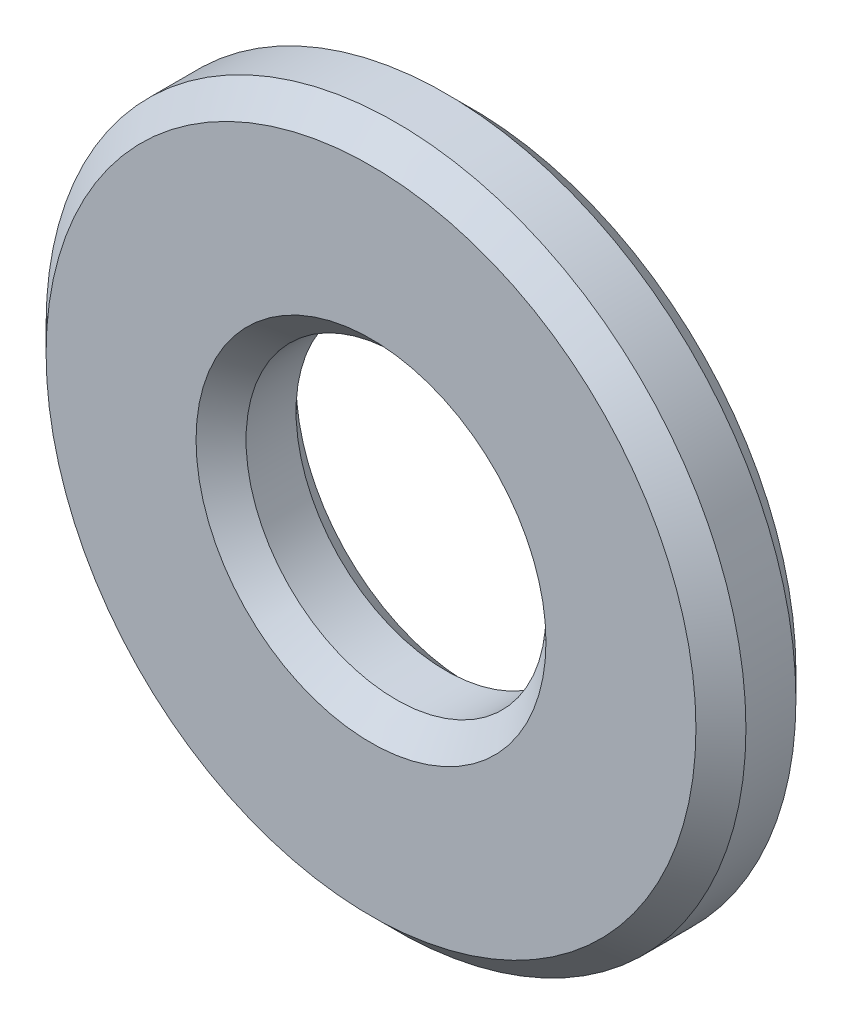
ISO-10303-21;
HEADER;
FILE_DESCRIPTION(('STEP AP214'),'2;1');
FILE_NAME('part.step','',(''),(''),'','','');
FILE_SCHEMA(('AUTOMOTIVE_DESIGN { 1 0 10303 214 1 1 1 1 }'));
ENDSEC;
DATA;
#1=APPLICATION_CONTEXT('core data for automotive mechanical design processes');
#2=APPLICATION_PROTOCOL_DEFINITION('international standard','automotive_design',2000,#1);
#3=PRODUCT_CONTEXT('',#1,'mechanical');
#4=PRODUCT('Part','Part','',(#3));
#5=PRODUCT_RELATED_PRODUCT_CATEGORY('part','',(#4));
#6=PRODUCT_DEFINITION_FORMATION('','',#4);
#7=PRODUCT_DEFINITION_CONTEXT('part definition',#1,'design');
#8=PRODUCT_DEFINITION('design','',#6,#7);
#9=PRODUCT_DEFINITION_SHAPE('','',#8);
#10=(LENGTH_UNIT() NAMED_UNIT(*) SI_UNIT(.MILLI.,.METRE.));
#11=(NAMED_UNIT(*) PLANE_ANGLE_UNIT() SI_UNIT($,.RADIAN.));
#12=(NAMED_UNIT(*) SI_UNIT($,.STERADIAN.) SOLID_ANGLE_UNIT());
#13=UNCERTAINTY_MEASURE_WITH_UNIT(LENGTH_MEASURE(1.E-05),#10,'distance_accuracy_value','');
#14=(GEOMETRIC_REPRESENTATION_CONTEXT(3) GLOBAL_UNCERTAINTY_ASSIGNED_CONTEXT((#13)) GLOBAL_UNIT_ASSIGNED_CONTEXT((#10,
#11,#12)) REPRESENTATION_CONTEXT('',''));
#15=CARTESIAN_POINT('',(0.,0.,0.));
#16=DIRECTION('',(0.,0.,1.));
#17=DIRECTION('',(1.,0.,0.));
#18=AXIS2_PLACEMENT_3D('',#15,#16,#17);
#19=CARTESIAN_POINT('',(0.,0.,-1.));
#20=DIRECTION('',(0.,0.,1.));
#21=DIRECTION('',(1.,0.,0.));
#22=AXIS2_PLACEMENT_3D('',#19,#20,#21);
#23=CYLINDRICAL_SURFACE('',#22,3.5);
#24=CARTESIAN_POINT('',(0.,0.,-0.75));
#25=DIRECTION('',(0.,0.,1.));
#26=DIRECTION('',(1.,0.,0.));
#27=AXIS2_PLACEMENT_3D('',#24,#25,#26);
#28=CIRCLE('',#27,3.5);
#29=CARTESIAN_POINT('',(3.5,0.,-0.75));
#30=VERTEX_POINT('',#29);
#31=EDGE_CURVE('E77',#30,#30,#28,.T.);
#32=ORIENTED_EDGE('',*,*,#31,.T.);
#33=EDGE_LOOP('',(#32));
#34=FACE_BOUND('',#33,.T.);
#35=CARTESIAN_POINT('',(0.,0.,-0.250000000000001));
#36=DIRECTION('',(0.,0.,1.));
#37=DIRECTION('',(1.,0.,0.));
#38=AXIS2_PLACEMENT_3D('',#35,#36,#37);
#39=CIRCLE('',#38,3.5);
#40=CARTESIAN_POINT('',(3.5,0.,-0.250000000000001));
#41=VERTEX_POINT('',#40);
#42=EDGE_CURVE('E76',#41,#41,#39,.F.);
#43=ORIENTED_EDGE('',*,*,#42,.T.);
#44=EDGE_LOOP('',(#43));
#45=FACE_BOUND('',#44,.T.);
#46=ADVANCED_FACE('F47',(#34,#45),#23,.T.);
#47=CARTESIAN_POINT('',(0.,0.,-1.));
#48=DIRECTION('',(0.,0.,1.));
#49=DIRECTION('',(1.,0.,0.));
#50=AXIS2_PLACEMENT_3D('',#47,#48,#49);
#51=PLANE('',#50);
#52=CARTESIAN_POINT('',(0.,0.,-1.));
#53=DIRECTION('',(0.,0.,1.));
#54=DIRECTION('',(1.,0.,0.));
#55=AXIS2_PLACEMENT_3D('',#52,#53,#54);
#56=CIRCLE('',#55,3.25);
#57=CARTESIAN_POINT('',(3.25,0.,-1.));
#58=VERTEX_POINT('',#57);
#59=EDGE_CURVE('E69',#58,#58,#56,.F.);
#60=ORIENTED_EDGE('',*,*,#59,.T.);
#61=EDGE_LOOP('',(#60));
#62=FACE_BOUND('',#61,.T.);
#63=CARTESIAN_POINT('',(0.,0.,-1.));
#64=DIRECTION('',(0.,0.,1.));
#65=DIRECTION('',(1.,0.,0.));
#66=AXIS2_PLACEMENT_3D('',#63,#64,#65);
#67=CIRCLE('',#66,1.75);
#68=CARTESIAN_POINT('',(1.75,0.,-1.));
#69=VERTEX_POINT('',#68);
#70=EDGE_CURVE('E71',#69,#69,#67,.T.);
#71=ORIENTED_EDGE('',*,*,#70,.T.);
#72=EDGE_LOOP('',(#71));
#73=FACE_BOUND('',#72,.T.);
#74=ADVANCED_FACE('F98',(#62,#73),#51,.F.);
#75=CARTESIAN_POINT('',(0.,0.,0.));
#76=DIRECTION('',(0.,0.,1.));
#77=DIRECTION('',(1.,0.,0.));
#78=AXIS2_PLACEMENT_3D('',#75,#76,#77);
#79=PLANE('',#78);
#80=CARTESIAN_POINT('',(0.,0.,0.));
#81=DIRECTION('',(0.,0.,1.));
#82=DIRECTION('',(1.,0.,0.));
#83=AXIS2_PLACEMENT_3D('',#80,#81,#82);
#84=CIRCLE('',#83,3.25);
#85=CARTESIAN_POINT('',(3.25,0.,0.));
#86=VERTEX_POINT('',#85);
#87=EDGE_CURVE('E10',#86,#86,#84,.T.);
#88=ORIENTED_EDGE('',*,*,#87,.T.);
#89=EDGE_LOOP('',(#88));
#90=FACE_BOUND('',#89,.T.);
#91=CARTESIAN_POINT('',(0.,0.,0.));
#92=DIRECTION('',(0.,0.,1.));
#93=DIRECTION('',(1.,0.,0.));
#94=AXIS2_PLACEMENT_3D('',#91,#92,#93);
#95=CIRCLE('',#94,1.75);
#96=CARTESIAN_POINT('',(1.75,0.,0.));
#97=VERTEX_POINT('',#96);
#98=EDGE_CURVE('E60',#97,#97,#95,.F.);
#99=ORIENTED_EDGE('',*,*,#98,.T.);
#100=EDGE_LOOP('',(#99));
#101=FACE_BOUND('',#100,.T.);
#102=ADVANCED_FACE('F102',(#90,#101),#79,.T.);
#103=CARTESIAN_POINT('',(0.,0.,-1.));
#104=DIRECTION('',(0.,0.,1.));
#105=DIRECTION('',(1.,0.,0.));
#106=AXIS2_PLACEMENT_3D('',#103,#104,#105);
#107=CYLINDRICAL_SURFACE('',#106,1.5);
#108=CARTESIAN_POINT('',(0.,0.,-0.749999999999999));
#109=DIRECTION('',(0.,0.,1.));
#110=DIRECTION('',(1.,0.,0.));
#111=AXIS2_PLACEMENT_3D('',#108,#109,#110);
#112=CIRCLE('',#111,1.5);
#113=CARTESIAN_POINT('',(1.5,0.,-0.749999999999999));
#114=VERTEX_POINT('',#113);
#115=EDGE_CURVE('E64',#114,#114,#112,.F.);
#116=ORIENTED_EDGE('',*,*,#115,.T.);
#117=EDGE_LOOP('',(#116));
#118=FACE_BOUND('',#117,.T.);
#119=CARTESIAN_POINT('',(0.,0.,-0.250000000000001));
#120=DIRECTION('',(0.,0.,1.));
#121=DIRECTION('',(1.,0.,0.));
#122=AXIS2_PLACEMENT_3D('',#119,#120,#121);
#123=CIRCLE('',#122,1.5);
#124=CARTESIAN_POINT('',(1.5,0.,-0.250000000000001));
#125=VERTEX_POINT('',#124);
#126=EDGE_CURVE('E62',#125,#125,#123,.T.);
#127=ORIENTED_EDGE('',*,*,#126,.T.);
#128=EDGE_LOOP('',(#127));
#129=FACE_BOUND('',#128,.T.);
#130=ADVANCED_FACE('F111',(#118,#129),#107,.F.);
#131=CARTESIAN_POINT('',(0.,0.,-0.75));
#132=DIRECTION('',(0.,0.,1.));
#133=DIRECTION('',(1.,0.,0.));
#134=AXIS2_PLACEMENT_3D('',#131,#132,#133);
#135=CONICAL_SURFACE('',#134,3.5,0.78539816339745);
#136=ORIENTED_EDGE('',*,*,#59,.F.);
#137=EDGE_LOOP('',(#136));
#138=FACE_BOUND('',#137,.T.);
#139=ORIENTED_EDGE('',*,*,#31,.F.);
#140=EDGE_LOOP('',(#139));
#141=FACE_BOUND('',#140,.T.);
#142=ADVANCED_FACE('F91',(#138,#141),#135,.T.);
#143=CARTESIAN_POINT('',(0.,0.,-1.));
#144=DIRECTION('',(0.,0.,-1.));
#145=DIRECTION('',(-1.,0.,0.));
#146=AXIS2_PLACEMENT_3D('',#143,#144,#145);
#147=CONICAL_SURFACE('',#146,1.75,0.785398163397447);
#148=ORIENTED_EDGE('',*,*,#115,.F.);
#149=EDGE_LOOP('',(#148));
#150=FACE_BOUND('',#149,.T.);
#151=ORIENTED_EDGE('',*,*,#70,.F.);
#152=EDGE_LOOP('',(#151));
#153=FACE_BOUND('',#152,.T.);
#154=ADVANCED_FACE('F87',(#150,#153),#147,.F.);
#155=CARTESIAN_POINT('',(0.,0.,0.));
#156=DIRECTION('',(0.,0.,-1.));
#157=DIRECTION('',(-1.,0.,0.));
#158=AXIS2_PLACEMENT_3D('',#155,#156,#157);
#159=CONICAL_SURFACE('',#158,3.25,0.785398163397447);
#160=ORIENTED_EDGE('',*,*,#42,.F.);
#161=EDGE_LOOP('',(#160));
#162=FACE_BOUND('',#161,.T.);
#163=ORIENTED_EDGE('',*,*,#87,.F.);
#164=EDGE_LOOP('',(#163));
#165=FACE_BOUND('',#164,.T.);
#166=ADVANCED_FACE('F82',(#162,#165),#159,.T.);
#167=CARTESIAN_POINT('',(0.,0.,-0.250000000000001));
#168=DIRECTION('',(0.,0.,1.));
#169=DIRECTION('',(1.,0.,0.));
#170=AXIS2_PLACEMENT_3D('',#167,#168,#169);
#171=CONICAL_SURFACE('',#170,1.5,0.78539816339745);
#172=ORIENTED_EDGE('',*,*,#98,.F.);
#173=EDGE_LOOP('',(#172));
#174=FACE_BOUND('',#173,.T.);
#175=ORIENTED_EDGE('',*,*,#126,.F.);
#176=EDGE_LOOP('',(#175));
#177=FACE_BOUND('',#176,.T.);
#178=ADVANCED_FACE('F55',(#174,#177),#171,.F.);
#179=CLOSED_SHELL('',(#46,#74,#102,#130,#142,#154,#166,#178));
#180=MANIFOLD_SOLID_BREP('B2',#179);
#181=ADVANCED_BREP_SHAPE_REPRESENTATION('',(#18,#180),#14);
#182=SHAPE_DEFINITION_REPRESENTATION(#9,#181);
ENDSEC;
END-ISO-10303-21;
